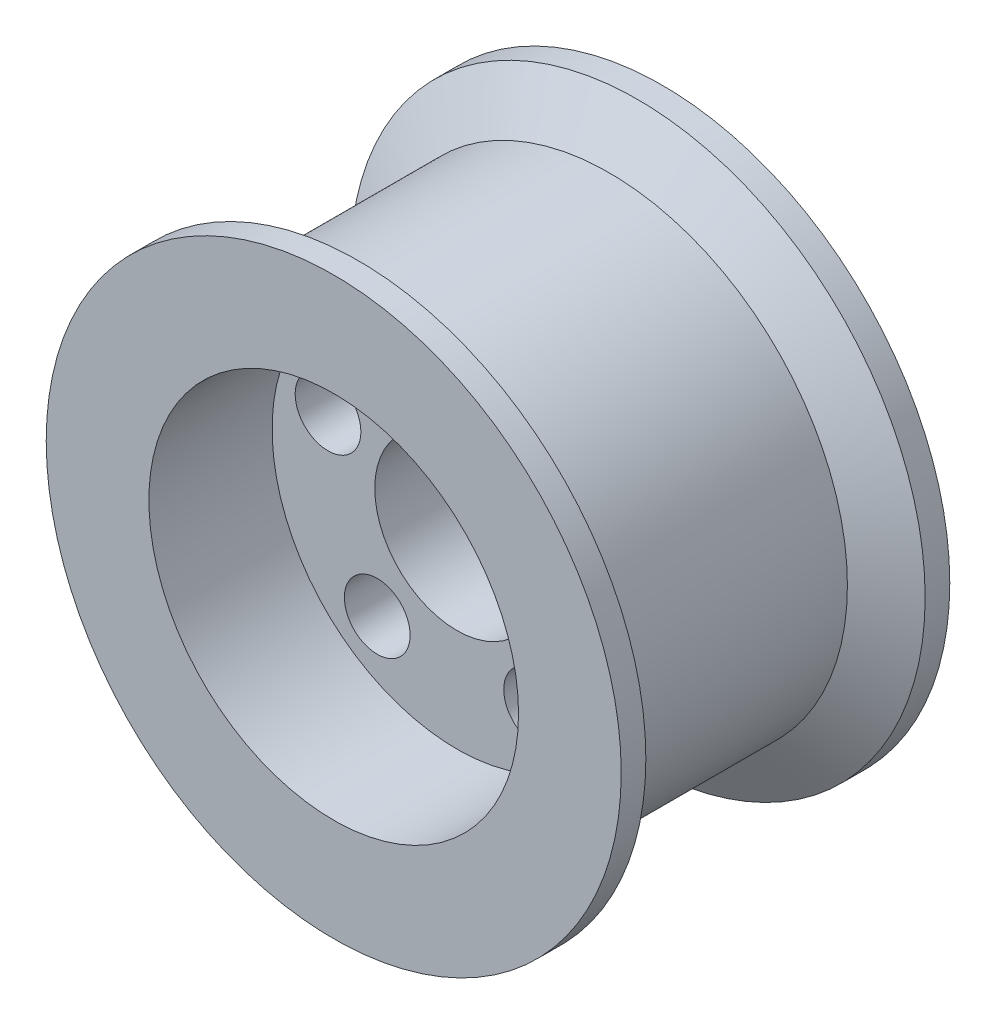
ISO-10303-21;
HEADER;
FILE_DESCRIPTION(('STEP AP214'),'2;1');
FILE_NAME('part.step','',(''),(''),'','','');
FILE_SCHEMA(('AUTOMOTIVE_DESIGN { 1 0 10303 214 1 1 1 1 }'));
ENDSEC;
DATA;
#1=APPLICATION_CONTEXT('core data for automotive mechanical design processes');
#2=APPLICATION_PROTOCOL_DEFINITION('international standard','automotive_design',2000,#1);
#3=PRODUCT_CONTEXT('',#1,'mechanical');
#4=PRODUCT('Part','Part','',(#3));
#5=PRODUCT_RELATED_PRODUCT_CATEGORY('part','',(#4));
#6=PRODUCT_DEFINITION_FORMATION('','',#4);
#7=PRODUCT_DEFINITION_CONTEXT('part definition',#1,'design');
#8=PRODUCT_DEFINITION('design','',#6,#7);
#9=PRODUCT_DEFINITION_SHAPE('','',#8);
#10=(LENGTH_UNIT() NAMED_UNIT(*) SI_UNIT(.MILLI.,.METRE.));
#11=(NAMED_UNIT(*) PLANE_ANGLE_UNIT() SI_UNIT($,.RADIAN.));
#12=(NAMED_UNIT(*) SI_UNIT($,.STERADIAN.) SOLID_ANGLE_UNIT());
#13=UNCERTAINTY_MEASURE_WITH_UNIT(LENGTH_MEASURE(1.E-05),#10,'distance_accuracy_value','');
#14=(GEOMETRIC_REPRESENTATION_CONTEXT(3) GLOBAL_UNCERTAINTY_ASSIGNED_CONTEXT((#13)) GLOBAL_UNIT_ASSIGNED_CONTEXT((#10,
#11,#12)) REPRESENTATION_CONTEXT('',''));
#15=CARTESIAN_POINT('',(0.,0.,0.));
#16=DIRECTION('',(0.,0.,1.));
#17=DIRECTION('',(1.,0.,0.));
#18=AXIS2_PLACEMENT_3D('',#15,#16,#17);
#19=CARTESIAN_POINT('',(0.,0.,20.));
#20=DIRECTION('',(0.,0.,-1.));
#21=DIRECTION('',(-1.,0.,0.));
#22=AXIS2_PLACEMENT_3D('',#19,#20,#21);
#23=CYLINDRICAL_SURFACE('',#22,35.);
#24=CARTESIAN_POINT('',(0.,0.,-20.));
#25=DIRECTION('',(0.,0.,1.));
#26=DIRECTION('',(1.,0.,0.));
#27=AXIS2_PLACEMENT_3D('',#24,#25,#26);
#28=CIRCLE('',#27,35.);
#29=CARTESIAN_POINT('',(35.,0.,-20.));
#30=VERTEX_POINT('',#29);
#31=EDGE_CURVE('E37',#30,#30,#28,.T.);
#32=ORIENTED_EDGE('',*,*,#31,.T.);
#33=EDGE_LOOP('',(#32));
#34=FACE_BOUND('',#33,.T.);
#35=CARTESIAN_POINT('',(0.,0.,-17.));
#36=DIRECTION('',(0.,0.,-1.));
#37=DIRECTION('',(-1.,0.,0.));
#38=AXIS2_PLACEMENT_3D('',#35,#36,#37);
#39=CIRCLE('',#38,35.);
#40=CARTESIAN_POINT('',(-35.,0.,-17.));
#41=VERTEX_POINT('',#40);
#42=EDGE_CURVE('E114',#41,#41,#39,.T.);
#43=ORIENTED_EDGE('',*,*,#42,.T.);
#44=EDGE_LOOP('',(#43));
#45=FACE_BOUND('',#44,.T.);
#46=ADVANCED_FACE('F30',(#34,#45),#23,.T.);
#47=CARTESIAN_POINT('',(0.,0.,20.));
#48=DIRECTION('',(0.,0.,1.));
#49=DIRECTION('',(1.,0.,0.));
#50=AXIS2_PLACEMENT_3D('',#47,#48,#49);
#51=CIRCLE('',#50,35.);
#52=CARTESIAN_POINT('',(35.,0.,20.));
#53=VERTEX_POINT('',#52);
#54=EDGE_CURVE('E10',#53,#53,#51,.T.);
#55=ORIENTED_EDGE('',*,*,#54,.F.);
#56=EDGE_LOOP('',(#55));
#57=FACE_BOUND('',#56,.T.);
#58=CARTESIAN_POINT('',(0.,0.,17.));
#59=DIRECTION('',(0.,0.,-1.));
#60=DIRECTION('',(-1.,0.,0.));
#61=AXIS2_PLACEMENT_3D('',#58,#59,#60);
#62=CIRCLE('',#61,35.);
#63=CARTESIAN_POINT('',(-35.,0.,17.));
#64=VERTEX_POINT('',#63);
#65=EDGE_CURVE('E278',#64,#64,#62,.T.);
#66=ORIENTED_EDGE('',*,*,#65,.F.);
#67=EDGE_LOOP('',(#66));
#68=FACE_BOUND('',#67,.T.);
#69=ADVANCED_FACE('F101',(#57,#68),#23,.T.);
#70=CARTESIAN_POINT('',(0.,0.,20.));
#71=DIRECTION('',(0.,0.,-1.));
#72=DIRECTION('',(-1.,0.,0.));
#73=AXIS2_PLACEMENT_3D('',#70,#71,#72);
#74=CYLINDRICAL_SURFACE('',#73,10.);
#75=CARTESIAN_POINT('',(0.,0.,5.));
#76=DIRECTION('',(0.,0.,1.));
#77=DIRECTION('',(1.,0.,0.));
#78=AXIS2_PLACEMENT_3D('',#75,#76,#77);
#79=CIRCLE('',#78,10.);
#80=CARTESIAN_POINT('',(10.,0.,5.));
#81=VERTEX_POINT('',#80);
#82=EDGE_CURVE('E42',#81,#81,#79,.T.);
#83=ORIENTED_EDGE('',*,*,#82,.T.);
#84=EDGE_LOOP('',(#83));
#85=FACE_BOUND('',#84,.T.);
#86=CARTESIAN_POINT('',(0.,0.,-5.));
#87=DIRECTION('',(0.,0.,-1.));
#88=DIRECTION('',(-1.,0.,0.));
#89=AXIS2_PLACEMENT_3D('',#86,#87,#88);
#90=CIRCLE('',#89,10.);
#91=CARTESIAN_POINT('',(-10.,0.,-5.));
#92=VERTEX_POINT('',#91);
#93=EDGE_CURVE('E51',#92,#92,#90,.T.);
#94=ORIENTED_EDGE('',*,*,#93,.T.);
#95=EDGE_LOOP('',(#94));
#96=FACE_BOUND('',#95,.T.);
#97=ADVANCED_FACE('F94',(#85,#96),#74,.F.);
#98=CARTESIAN_POINT('',(0.,0.,20.));
#99=DIRECTION('',(0.,0.,1.));
#100=DIRECTION('',(1.,0.,0.));
#101=AXIS2_PLACEMENT_3D('',#98,#99,#100);
#102=PLANE('',#101);
#103=CARTESIAN_POINT('',(0.,0.,20.));
#104=DIRECTION('',(0.,0.,1.));
#105=DIRECTION('',(1.,0.,0.));
#106=AXIS2_PLACEMENT_3D('',#103,#104,#105);
#107=CIRCLE('',#106,22.5);
#108=CARTESIAN_POINT('',(22.5,0.,20.));
#109=VERTEX_POINT('',#108);
#110=EDGE_CURVE('E45',#109,#109,#107,.T.);
#111=ORIENTED_EDGE('',*,*,#110,.F.);
#112=EDGE_LOOP('',(#111));
#113=FACE_BOUND('',#112,.T.);
#114=ORIENTED_EDGE('',*,*,#54,.T.);
#115=EDGE_LOOP('',(#114));
#116=FACE_BOUND('',#115,.T.);
#117=ADVANCED_FACE('F91',(#113,#116),#102,.T.);
#118=CARTESIAN_POINT('',(0.,0.,-20.));
#119=DIRECTION('',(0.,0.,1.));
#120=DIRECTION('',(1.,0.,0.));
#121=AXIS2_PLACEMENT_3D('',#118,#119,#120);
#122=PLANE('',#121);
#123=CARTESIAN_POINT('',(0.,0.,-20.));
#124=DIRECTION('',(0.,0.,1.));
#125=DIRECTION('',(1.,0.,0.));
#126=AXIS2_PLACEMENT_3D('',#123,#124,#125);
#127=CIRCLE('',#126,22.5);
#128=CARTESIAN_POINT('',(22.5,0.,-20.));
#129=VERTEX_POINT('',#128);
#130=EDGE_CURVE('E58',#129,#129,#127,.T.);
#131=ORIENTED_EDGE('',*,*,#130,.T.);
#132=EDGE_LOOP('',(#131));
#133=FACE_BOUND('',#132,.T.);
#134=ORIENTED_EDGE('',*,*,#31,.F.);
#135=EDGE_LOOP('',(#134));
#136=FACE_BOUND('',#135,.T.);
#137=ADVANCED_FACE('F93',(#133,#136),#122,.F.);
#138=CARTESIAN_POINT('',(0.,0.,5.));
#139=DIRECTION('',(0.,0.,1.));
#140=DIRECTION('',(1.,0.,0.));
#141=AXIS2_PLACEMENT_3D('',#138,#139,#140);
#142=CYLINDRICAL_SURFACE('',#141,22.5);
#143=CARTESIAN_POINT('',(0.,0.,5.));
#144=DIRECTION('',(0.,0.,1.));
#145=DIRECTION('',(1.,0.,0.));
#146=AXIS2_PLACEMENT_3D('',#143,#144,#145);
#147=CIRCLE('',#146,22.5);
#148=CARTESIAN_POINT('',(22.5,0.,5.));
#149=VERTEX_POINT('',#148);
#150=EDGE_CURVE('E50',#149,#149,#147,.T.);
#151=ORIENTED_EDGE('',*,*,#150,.F.);
#152=EDGE_LOOP('',(#151));
#153=FACE_BOUND('',#152,.T.);
#154=ORIENTED_EDGE('',*,*,#110,.T.);
#155=EDGE_LOOP('',(#154));
#156=FACE_BOUND('',#155,.T.);
#157=ADVANCED_FACE('F89',(#153,#156),#142,.F.);
#158=CARTESIAN_POINT('',(0.,0.,5.));
#159=DIRECTION('',(0.,0.,1.));
#160=DIRECTION('',(1.,0.,0.));
#161=AXIS2_PLACEMENT_3D('',#158,#159,#160);
#162=PLANE('',#161);
#163=CARTESIAN_POINT('',(15.69243251887,5.09878040718681,5.));
#164=DIRECTION('',(0.,0.,1.));
#165=DIRECTION('',(0.309016994374958,-0.95105651629515,0.));
#166=AXIS2_PLACEMENT_3D('',#163,#164,#165);
#167=CIRCLE('',#166,4.);
#168=CARTESIAN_POINT('',(16.9285004963698,1.29455434200621,5.));
#169=VERTEX_POINT('',#168);
#170=EDGE_CURVE('E116',#169,#169,#167,.T.);
#171=ORIENTED_EDGE('',*,*,#170,.F.);
#172=EDGE_LOOP('',(#171));
#173=FACE_BOUND('',#172,.T.);
#174=CARTESIAN_POINT('',(9.69845666282592,-13.3487804071865,5.));
#175=DIRECTION('',(0.,0.,1.));
#176=DIRECTION('',(-0.809016994374942,-0.58778525229248,0.));
#177=AXIS2_PLACEMENT_3D('',#174,#175,#176);
#178=CIRCLE('',#177,4.);
#179=CARTESIAN_POINT('',(6.46238868532615,-15.6999214163565,5.));
#180=VERTEX_POINT('',#179);
#181=EDGE_CURVE('E120',#180,#180,#178,.T.);
#182=ORIENTED_EDGE('',*,*,#181,.F.);
#183=EDGE_LOOP('',(#182));
#184=FACE_BOUND('',#183,.T.);
#185=CARTESIAN_POINT('',(-9.69845666282573,-13.3487804071867,5.));
#186=DIRECTION('',(0.,0.,1.));
#187=DIRECTION('',(-0.809016994374951,0.587785252292469,0.));
#188=AXIS2_PLACEMENT_3D('',#185,#186,#187);
#189=CIRCLE('',#188,4.);
#190=CARTESIAN_POINT('',(-12.9345246403255,-10.9976393980168,5.));
#191=VERTEX_POINT('',#190);
#192=EDGE_CURVE('E126',#191,#191,#189,.T.);
#193=ORIENTED_EDGE('',*,*,#192,.F.);
#194=EDGE_LOOP('',(#193));
#195=FACE_BOUND('',#194,.T.);
#196=CARTESIAN_POINT('',(-15.6924325188701,5.09878040718659,5.));
#197=DIRECTION('',(0.,0.,1.));
#198=DIRECTION('',(0.309016994374945,0.951056516295155,0.));
#199=AXIS2_PLACEMENT_3D('',#196,#197,#198);
#200=CIRCLE('',#199,4.);
#201=CARTESIAN_POINT('',(-14.4563645413703,8.90300647236721,5.));
#202=VERTEX_POINT('',#201);
#203=EDGE_CURVE('E64',#202,#202,#200,.T.);
#204=ORIENTED_EDGE('',*,*,#203,.F.);
#205=EDGE_LOOP('',(#204));
#206=FACE_BOUND('',#205,.T.);
#207=CARTESIAN_POINT('',(0.,16.5,5.));
#208=DIRECTION('',(0.,0.,1.));
#209=DIRECTION('',(1.,0.,0.));
#210=AXIS2_PLACEMENT_3D('',#207,#208,#209);
#211=CIRCLE('',#210,4.);
#212=CARTESIAN_POINT('',(4.,16.5,5.));
#213=VERTEX_POINT('',#212);
#214=EDGE_CURVE('E59',#213,#213,#211,.T.);
#215=ORIENTED_EDGE('',*,*,#214,.F.);
#216=EDGE_LOOP('',(#215));
#217=FACE_BOUND('',#216,.T.);
#218=ORIENTED_EDGE('',*,*,#82,.F.);
#219=EDGE_LOOP('',(#218));
#220=FACE_BOUND('',#219,.T.);
#221=ORIENTED_EDGE('',*,*,#150,.T.);
#222=EDGE_LOOP('',(#221));
#223=FACE_BOUND('',#222,.T.);
#224=ADVANCED_FACE('F134',(#173,#184,#195,#206,#217,#220,#223),#162,.T.);
#225=CARTESIAN_POINT('',(0.,0.,-5.));
#226=DIRECTION('',(0.,0.,-1.));
#227=DIRECTION('',(-1.,0.,0.));
#228=AXIS2_PLACEMENT_3D('',#225,#226,#227);
#229=CYLINDRICAL_SURFACE('',#228,22.5);
#230=CARTESIAN_POINT('',(0.,0.,-5.));
#231=DIRECTION('',(0.,0.,1.));
#232=DIRECTION('',(1.,0.,0.));
#233=AXIS2_PLACEMENT_3D('',#230,#231,#232);
#234=CIRCLE('',#233,22.5);
#235=CARTESIAN_POINT('',(22.5,0.,-5.));
#236=VERTEX_POINT('',#235);
#237=EDGE_CURVE('E54',#236,#236,#234,.T.);
#238=ORIENTED_EDGE('',*,*,#237,.T.);
#239=EDGE_LOOP('',(#238));
#240=FACE_BOUND('',#239,.T.);
#241=ORIENTED_EDGE('',*,*,#130,.F.);
#242=EDGE_LOOP('',(#241));
#243=FACE_BOUND('',#242,.T.);
#244=ADVANCED_FACE('F137',(#240,#243),#229,.F.);
#245=CARTESIAN_POINT('',(0.,0.,-5.));
#246=DIRECTION('',(0.,0.,-1.));
#247=DIRECTION('',(1.,0.,0.));
#248=AXIS2_PLACEMENT_3D('',#245,#246,#247);
#249=PLANE('',#248);
#250=CARTESIAN_POINT('',(15.69243251887,5.09878040718681,-5.));
#251=DIRECTION('',(0.,0.,-1.));
#252=DIRECTION('',(-1.,0.,0.));
#253=AXIS2_PLACEMENT_3D('',#250,#251,#252);
#254=CIRCLE('',#253,4.);
#255=CARTESIAN_POINT('',(11.69243251887,5.09878040718681,-5.));
#256=VERTEX_POINT('',#255);
#257=EDGE_CURVE('E33',#256,#256,#254,.T.);
#258=ORIENTED_EDGE('',*,*,#257,.F.);
#259=EDGE_LOOP('',(#258));
#260=FACE_BOUND('',#259,.T.);
#261=CARTESIAN_POINT('',(9.69845666282592,-13.3487804071865,-5.));
#262=DIRECTION('',(0.,0.,-1.));
#263=DIRECTION('',(-1.,0.,0.));
#264=AXIS2_PLACEMENT_3D('',#261,#262,#263);
#265=CIRCLE('',#264,4.);
#266=CARTESIAN_POINT('',(5.69845666282592,-13.3487804071865,-5.));
#267=VERTEX_POINT('',#266);
#268=EDGE_CURVE('E66',#267,#267,#265,.T.);
#269=ORIENTED_EDGE('',*,*,#268,.F.);
#270=EDGE_LOOP('',(#269));
#271=FACE_BOUND('',#270,.T.);
#272=CARTESIAN_POINT('',(-9.69845666282573,-13.3487804071867,-5.));
#273=DIRECTION('',(0.,0.,-1.));
#274=DIRECTION('',(-1.,0.,0.));
#275=AXIS2_PLACEMENT_3D('',#272,#273,#274);
#276=CIRCLE('',#275,4.);
#277=CARTESIAN_POINT('',(-13.6984566628257,-13.3487804071867,-5.));
#278=VERTEX_POINT('',#277);
#279=EDGE_CURVE('E63',#278,#278,#276,.T.);
#280=ORIENTED_EDGE('',*,*,#279,.F.);
#281=EDGE_LOOP('',(#280));
#282=FACE_BOUND('',#281,.T.);
#283=CARTESIAN_POINT('',(-15.6924325188701,5.09878040718659,-5.));
#284=DIRECTION('',(0.,0.,-1.));
#285=DIRECTION('',(-1.,0.,0.));
#286=AXIS2_PLACEMENT_3D('',#283,#284,#285);
#287=CIRCLE('',#286,4.);
#288=CARTESIAN_POINT('',(-19.6924325188701,5.09878040718659,-5.));
#289=VERTEX_POINT('',#288);
#290=EDGE_CURVE('E60',#289,#289,#287,.T.);
#291=ORIENTED_EDGE('',*,*,#290,.F.);
#292=EDGE_LOOP('',(#291));
#293=FACE_BOUND('',#292,.T.);
#294=CARTESIAN_POINT('',(0.,16.5,-5.));
#295=DIRECTION('',(0.,0.,-1.));
#296=DIRECTION('',(-1.,0.,0.));
#297=AXIS2_PLACEMENT_3D('',#294,#295,#296);
#298=CIRCLE('',#297,4.);
#299=CARTESIAN_POINT('',(-4.,16.5,-5.));
#300=VERTEX_POINT('',#299);
#301=EDGE_CURVE('E55',#300,#300,#298,.T.);
#302=ORIENTED_EDGE('',*,*,#301,.F.);
#303=EDGE_LOOP('',(#302));
#304=FACE_BOUND('',#303,.T.);
#305=ORIENTED_EDGE('',*,*,#93,.F.);
#306=EDGE_LOOP('',(#305));
#307=FACE_BOUND('',#306,.T.);
#308=ORIENTED_EDGE('',*,*,#237,.F.);
#309=EDGE_LOOP('',(#308));
#310=FACE_BOUND('',#309,.T.);
#311=ADVANCED_FACE('F150',(#260,#271,#282,#293,#304,#307,#310),#249,.T.);
#312=CARTESIAN_POINT('',(0.,16.5,-20.));
#313=DIRECTION('',(0.,0.,1.));
#314=DIRECTION('',(1.,0.,0.));
#315=AXIS2_PLACEMENT_3D('',#312,#313,#314);
#316=CYLINDRICAL_SURFACE('',#315,4.);
#317=ORIENTED_EDGE('',*,*,#301,.T.);
#318=EDGE_LOOP('',(#317));
#319=FACE_BOUND('',#318,.T.);
#320=ORIENTED_EDGE('',*,*,#214,.T.);
#321=EDGE_LOOP('',(#320));
#322=FACE_BOUND('',#321,.T.);
#323=ADVANCED_FACE('F153',(#319,#322),#316,.F.);
#324=CARTESIAN_POINT('',(-15.6924325188701,5.09878040718659,-20.));
#325=DIRECTION('',(0.,0.,1.));
#326=DIRECTION('',(1.,0.,0.));
#327=AXIS2_PLACEMENT_3D('',#324,#325,#326);
#328=CYLINDRICAL_SURFACE('',#327,4.);
#329=ORIENTED_EDGE('',*,*,#290,.T.);
#330=EDGE_LOOP('',(#329));
#331=FACE_BOUND('',#330,.T.);
#332=ORIENTED_EDGE('',*,*,#203,.T.);
#333=EDGE_LOOP('',(#332));
#334=FACE_BOUND('',#333,.T.);
#335=ADVANCED_FACE('F195',(#331,#334),#328,.F.);
#336=CARTESIAN_POINT('',(-9.69845666282573,-13.3487804071867,-20.));
#337=DIRECTION('',(0.,0.,1.));
#338=DIRECTION('',(1.,0.,0.));
#339=AXIS2_PLACEMENT_3D('',#336,#337,#338);
#340=CYLINDRICAL_SURFACE('',#339,4.);
#341=ORIENTED_EDGE('',*,*,#279,.T.);
#342=EDGE_LOOP('',(#341));
#343=FACE_BOUND('',#342,.T.);
#344=ORIENTED_EDGE('',*,*,#192,.T.);
#345=EDGE_LOOP('',(#344));
#346=FACE_BOUND('',#345,.T.);
#347=ADVANCED_FACE('F200',(#343,#346),#340,.F.);
#348=CARTESIAN_POINT('',(9.69845666282592,-13.3487804071865,-20.));
#349=DIRECTION('',(0.,0.,1.));
#350=DIRECTION('',(1.,0.,0.));
#351=AXIS2_PLACEMENT_3D('',#348,#349,#350);
#352=CYLINDRICAL_SURFACE('',#351,4.);
#353=ORIENTED_EDGE('',*,*,#268,.T.);
#354=EDGE_LOOP('',(#353));
#355=FACE_BOUND('',#354,.T.);
#356=ORIENTED_EDGE('',*,*,#181,.T.);
#357=EDGE_LOOP('',(#356));
#358=FACE_BOUND('',#357,.T.);
#359=ADVANCED_FACE('F132',(#355,#358),#352,.F.);
#360=CARTESIAN_POINT('',(15.69243251887,5.09878040718681,-20.));
#361=DIRECTION('',(0.,0.,1.));
#362=DIRECTION('',(1.,0.,0.));
#363=AXIS2_PLACEMENT_3D('',#360,#361,#362);
#364=CYLINDRICAL_SURFACE('',#363,4.);
#365=ORIENTED_EDGE('',*,*,#257,.T.);
#366=EDGE_LOOP('',(#365));
#367=FACE_BOUND('',#366,.T.);
#368=ORIENTED_EDGE('',*,*,#170,.T.);
#369=EDGE_LOOP('',(#368));
#370=FACE_BOUND('',#369,.T.);
#371=ADVANCED_FACE('F219',(#367,#370),#364,.F.);
#372=CARTESIAN_POINT('',(0.,0.,-17.));
#373=DIRECTION('',(0.,0.,-1.));
#374=DIRECTION('',(-1.,0.,0.));
#375=AXIS2_PLACEMENT_3D('',#372,#373,#374);
#376=CONICAL_SURFACE('',#375,35.,1.04719755119659);
#377=CARTESIAN_POINT('',(0.,0.,-13.5358983848622));
#378=DIRECTION('',(0.,0.,-1.));
#379=DIRECTION('',(-1.,0.,0.));
#380=AXIS2_PLACEMENT_3D('',#377,#378,#379);
#381=CIRCLE('',#380,29.);
#382=CARTESIAN_POINT('',(-29.,0.,-13.5358983848622));
#383=VERTEX_POINT('',#382);
#384=EDGE_CURVE('E117',#383,#383,#381,.T.);
#385=ORIENTED_EDGE('',*,*,#384,.T.);
#386=EDGE_LOOP('',(#385));
#387=FACE_BOUND('',#386,.T.);
#388=ORIENTED_EDGE('',*,*,#42,.F.);
#389=EDGE_LOOP('',(#388));
#390=FACE_BOUND('',#389,.T.);
#391=ADVANCED_FACE('F227',(#387,#390),#376,.T.);
#392=CARTESIAN_POINT('',(0.,0.,-37.9268896717928));
#393=DIRECTION('',(0.,0.,-1.));
#394=DIRECTION('',(-1.,0.,0.));
#395=AXIS2_PLACEMENT_3D('',#392,#393,#394);
#396=CYLINDRICAL_SURFACE('',#395,29.);
#397=CARTESIAN_POINT('',(0.,0.,13.5358983848622));
#398=DIRECTION('',(0.,0.,-1.));
#399=DIRECTION('',(-1.,0.,0.));
#400=AXIS2_PLACEMENT_3D('',#397,#398,#399);
#401=CIRCLE('',#400,29.);
#402=CARTESIAN_POINT('',(-29.,0.,13.5358983848622));
#403=VERTEX_POINT('',#402);
#404=EDGE_CURVE('E122',#403,#403,#401,.T.);
#405=ORIENTED_EDGE('',*,*,#404,.T.);
#406=EDGE_LOOP('',(#405));
#407=FACE_BOUND('',#406,.T.);
#408=ORIENTED_EDGE('',*,*,#384,.F.);
#409=EDGE_LOOP('',(#408));
#410=FACE_BOUND('',#409,.T.);
#411=ADVANCED_FACE('F247',(#407,#410),#396,.T.);
#412=CARTESIAN_POINT('',(0.,0.,13.5358983848622));
#413=DIRECTION('',(0.,0.,1.));
#414=DIRECTION('',(1.,0.,0.));
#415=AXIS2_PLACEMENT_3D('',#412,#413,#414);
#416=CONICAL_SURFACE('',#415,29.,1.04719755119659);
#417=ORIENTED_EDGE('',*,*,#65,.T.);
#418=EDGE_LOOP('',(#417));
#419=FACE_BOUND('',#418,.T.);
#420=ORIENTED_EDGE('',*,*,#404,.F.);
#421=EDGE_LOOP('',(#420));
#422=FACE_BOUND('',#421,.T.);
#423=ADVANCED_FACE('F257',(#419,#422),#416,.T.);
#424=CLOSED_SHELL('',(#46,#69,#97,#117,#137,#157,#224,#244,#311,#323,#335,#347,#359,#371,#391,
#411,#423));
#425=MANIFOLD_SOLID_BREP('B2',#424);
#426=ADVANCED_BREP_SHAPE_REPRESENTATION('',(#18,#425),#14);
#427=SHAPE_DEFINITION_REPRESENTATION(#9,#426);
ENDSEC;
END-ISO-10303-21;
